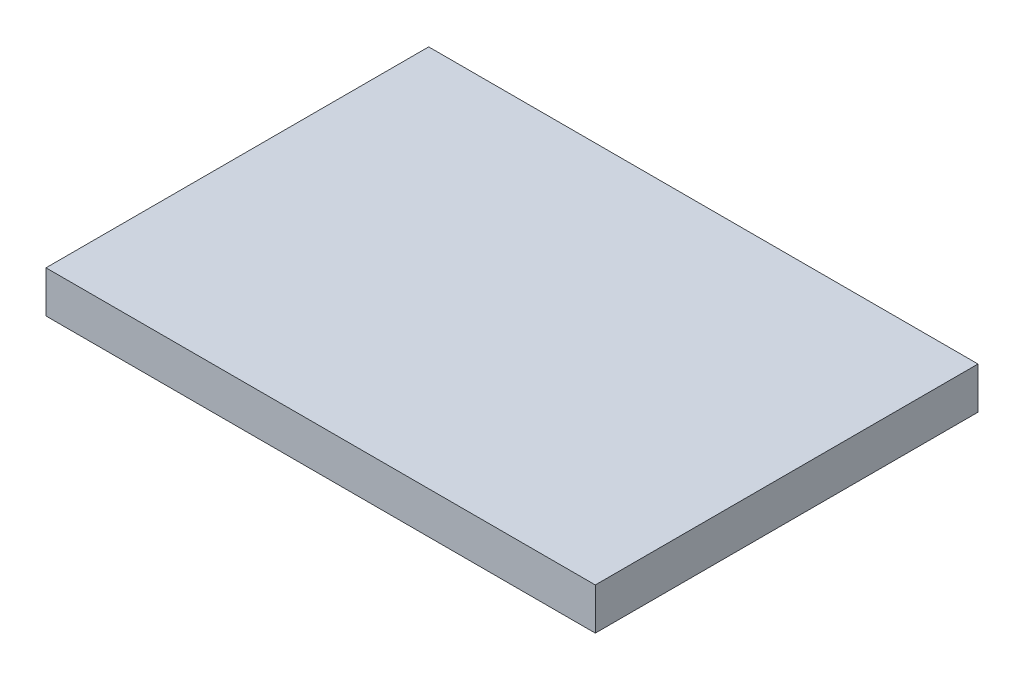
ISO-10303-21;
HEADER;
FILE_DESCRIPTION(('STEP AP214'),'2;1');
FILE_NAME('part.step','',(''),(''),'','','');
FILE_SCHEMA(('AUTOMOTIVE_DESIGN { 1 0 10303 214 1 1 1 1 }'));
ENDSEC;
DATA;
#1=APPLICATION_CONTEXT('core data for automotive mechanical design processes');
#2=APPLICATION_PROTOCOL_DEFINITION('international standard','automotive_design',2000,#1);
#3=PRODUCT_CONTEXT('',#1,'mechanical');
#4=PRODUCT('Part','Part','',(#3));
#5=PRODUCT_RELATED_PRODUCT_CATEGORY('part','',(#4));
#6=PRODUCT_DEFINITION_FORMATION('','',#4);
#7=PRODUCT_DEFINITION_CONTEXT('part definition',#1,'design');
#8=PRODUCT_DEFINITION('design','',#6,#7);
#9=PRODUCT_DEFINITION_SHAPE('','',#8);
#10=(LENGTH_UNIT() NAMED_UNIT(*) SI_UNIT(.MILLI.,.METRE.));
#11=(NAMED_UNIT(*) PLANE_ANGLE_UNIT() SI_UNIT($,.RADIAN.));
#12=(NAMED_UNIT(*) SI_UNIT($,.STERADIAN.) SOLID_ANGLE_UNIT());
#13=UNCERTAINTY_MEASURE_WITH_UNIT(LENGTH_MEASURE(1.E-05),#10,'distance_accuracy_value','');
#14=(GEOMETRIC_REPRESENTATION_CONTEXT(3) GLOBAL_UNCERTAINTY_ASSIGNED_CONTEXT((#13)) GLOBAL_UNIT_ASSIGNED_CONTEXT((#10,
#11,#12)) REPRESENTATION_CONTEXT('',''));
#15=CARTESIAN_POINT('',(0.,0.,0.));
#16=DIRECTION('',(0.,0.,1.));
#17=DIRECTION('',(1.,0.,0.));
#18=AXIS2_PLACEMENT_3D('',#15,#16,#17);
#19=CARTESIAN_POINT('',(-42.5,6.,-27.5));
#20=DIRECTION('',(1.,0.,0.));
#21=DIRECTION('',(0.,0.,-1.));
#22=AXIS2_PLACEMENT_3D('',#19,#20,#21);
#23=PLANE('',#22);
#24=DIRECTION('',(0.,0.,1.));
#25=VECTOR('',#24,1.);
#26=CARTESIAN_POINT('',(-42.5,0.,-27.5));
#27=LINE('',#26,#25);
#28=CARTESIAN_POINT('',(-42.5,0.,-27.5));
#29=VERTEX_POINT('',#28);
#30=CARTESIAN_POINT('',(-42.5,0.,27.5));
#31=VERTEX_POINT('',#30);
#32=EDGE_CURVE('E96',#29,#31,#27,.T.);
#33=ORIENTED_EDGE('',*,*,#32,.T.);
#34=DIRECTION('',(0.,-1.,0.));
#35=VECTOR('',#34,1.);
#36=CARTESIAN_POINT('',(-42.5,6.,27.5));
#37=LINE('',#36,#35);
#38=CARTESIAN_POINT('',(-42.5,6.,27.5));
#39=VERTEX_POINT('',#38);
#40=EDGE_CURVE('E11',#39,#31,#37,.T.);
#41=ORIENTED_EDGE('',*,*,#40,.F.);
#42=DIRECTION('',(0.,0.,1.));
#43=VECTOR('',#42,1.);
#44=CARTESIAN_POINT('',(-42.5,6.,-27.5));
#45=LINE('',#44,#43);
#46=CARTESIAN_POINT('',(-42.5,6.,-27.5));
#47=VERTEX_POINT('',#46);
#48=EDGE_CURVE('E84',#47,#39,#45,.T.);
#49=ORIENTED_EDGE('',*,*,#48,.F.);
#50=DIRECTION('',(0.,-1.,0.));
#51=VECTOR('',#50,1.);
#52=CARTESIAN_POINT('',(-42.5,6.,-27.5));
#53=LINE('',#52,#51);
#54=EDGE_CURVE('E92',#47,#29,#53,.T.);
#55=ORIENTED_EDGE('',*,*,#54,.T.);
#56=EDGE_LOOP('',(#33,#41,#49,#55));
#57=FACE_BOUND('',#56,.T.);
#58=ADVANCED_FACE('F33',(#57),#23,.F.);
#59=CARTESIAN_POINT('',(-42.5,6.,27.5));
#60=DIRECTION('',(0.,0.,-1.));
#61=DIRECTION('',(-1.,0.,0.));
#62=AXIS2_PLACEMENT_3D('',#59,#60,#61);
#63=PLANE('',#62);
#64=DIRECTION('',(1.,0.,0.));
#65=VECTOR('',#64,1.);
#66=CARTESIAN_POINT('',(-42.5,0.,27.5));
#67=LINE('',#66,#65);
#68=CARTESIAN_POINT('',(36.4465792802624,0.,27.5));
#69=VERTEX_POINT('',#68);
#70=EDGE_CURVE('E88',#31,#69,#67,.T.);
#71=ORIENTED_EDGE('',*,*,#70,.T.);
#72=DIRECTION('',(0.,-1.,0.));
#73=VECTOR('',#72,1.);
#74=CARTESIAN_POINT('',(36.4465792802624,6.,27.5));
#75=LINE('',#74,#73);
#76=CARTESIAN_POINT('',(36.4465792802624,6.,27.5));
#77=VERTEX_POINT('',#76);
#78=EDGE_CURVE('E41',#77,#69,#75,.T.);
#79=ORIENTED_EDGE('',*,*,#78,.F.);
#80=DIRECTION('',(1.,0.,0.));
#81=VECTOR('',#80,1.);
#82=CARTESIAN_POINT('',(-42.5,6.,27.5));
#83=LINE('',#82,#81);
#84=EDGE_CURVE('E79',#39,#77,#83,.T.);
#85=ORIENTED_EDGE('',*,*,#84,.F.);
#86=ORIENTED_EDGE('',*,*,#40,.T.);
#87=EDGE_LOOP('',(#71,#79,#85,#86));
#88=FACE_BOUND('',#87,.T.);
#89=ADVANCED_FACE('F87',(#88),#63,.F.);
#90=CARTESIAN_POINT('',(36.4465792802624,6.,-27.5));
#91=DIRECTION('',(-1.,0.,0.));
#92=DIRECTION('',(0.,0.,1.));
#93=AXIS2_PLACEMENT_3D('',#90,#91,#92);
#94=PLANE('',#93);
#95=DIRECTION('',(0.,0.,-1.));
#96=VECTOR('',#95,1.);
#97=CARTESIAN_POINT('',(36.4465792802624,0.,-27.5));
#98=LINE('',#97,#96);
#99=CARTESIAN_POINT('',(36.4465792802624,0.,-27.5));
#100=VERTEX_POINT('',#99);
#101=EDGE_CURVE('E66',#69,#100,#98,.T.);
#102=ORIENTED_EDGE('',*,*,#101,.T.);
#103=DIRECTION('',(0.,-1.,0.));
#104=VECTOR('',#103,1.);
#105=CARTESIAN_POINT('',(36.4465792802624,6.,-27.5));
#106=LINE('',#105,#104);
#107=CARTESIAN_POINT('',(36.4465792802624,6.,-27.5));
#108=VERTEX_POINT('',#107);
#109=EDGE_CURVE('E89',#108,#100,#106,.T.);
#110=ORIENTED_EDGE('',*,*,#109,.F.);
#111=DIRECTION('',(0.,0.,-1.));
#112=VECTOR('',#111,1.);
#113=CARTESIAN_POINT('',(36.4465792802624,6.,-27.5));
#114=LINE('',#113,#112);
#115=EDGE_CURVE('E82',#77,#108,#114,.T.);
#116=ORIENTED_EDGE('',*,*,#115,.F.);
#117=ORIENTED_EDGE('',*,*,#78,.T.);
#118=EDGE_LOOP('',(#102,#110,#116,#117));
#119=FACE_BOUND('',#118,.T.);
#120=ADVANCED_FACE('F90',(#119),#94,.F.);
#121=CARTESIAN_POINT('',(-42.5,6.,-27.5));
#122=DIRECTION('',(0.,0.,1.));
#123=DIRECTION('',(1.,0.,0.));
#124=AXIS2_PLACEMENT_3D('',#121,#122,#123);
#125=PLANE('',#124);
#126=DIRECTION('',(-1.,0.,0.));
#127=VECTOR('',#126,1.);
#128=CARTESIAN_POINT('',(-42.5,0.,-27.5));
#129=LINE('',#128,#127);
#130=EDGE_CURVE('E72',#100,#29,#129,.T.);
#131=ORIENTED_EDGE('',*,*,#130,.T.);
#132=ORIENTED_EDGE('',*,*,#54,.F.);
#133=DIRECTION('',(-1.,0.,0.));
#134=VECTOR('',#133,1.);
#135=CARTESIAN_POINT('',(-42.5,6.,-27.5));
#136=LINE('',#135,#134);
#137=EDGE_CURVE('E49',#108,#47,#136,.T.);
#138=ORIENTED_EDGE('',*,*,#137,.F.);
#139=ORIENTED_EDGE('',*,*,#109,.T.);
#140=EDGE_LOOP('',(#131,#132,#138,#139));
#141=FACE_BOUND('',#140,.T.);
#142=ADVANCED_FACE('F103',(#141),#125,.F.);
#143=CARTESIAN_POINT('',(-42.5,6.,27.5));
#144=DIRECTION('',(0.,1.,0.));
#145=DIRECTION('',(0.,0.,1.));
#146=AXIS2_PLACEMENT_3D('',#143,#144,#145);
#147=PLANE('',#146);
#148=ORIENTED_EDGE('',*,*,#48,.T.);
#149=ORIENTED_EDGE('',*,*,#84,.T.);
#150=ORIENTED_EDGE('',*,*,#115,.T.);
#151=ORIENTED_EDGE('',*,*,#137,.T.);
#152=EDGE_LOOP('',(#148,#149,#150,#151));
#153=FACE_BOUND('',#152,.T.);
#154=ADVANCED_FACE('F80',(#153),#147,.T.);
#155=CARTESIAN_POINT('',(-42.5,0.,27.5));
#156=DIRECTION('',(0.,1.,0.));
#157=DIRECTION('',(0.,0.,1.));
#158=AXIS2_PLACEMENT_3D('',#155,#156,#157);
#159=PLANE('',#158);
#160=ORIENTED_EDGE('',*,*,#32,.F.);
#161=ORIENTED_EDGE('',*,*,#130,.F.);
#162=ORIENTED_EDGE('',*,*,#101,.F.);
#163=ORIENTED_EDGE('',*,*,#70,.F.);
#164=EDGE_LOOP('',(#160,#161,#162,#163));
#165=FACE_BOUND('',#164,.T.);
#166=ADVANCED_FACE('F106',(#165),#159,.F.);
#167=CLOSED_SHELL('',(#58,#89,#120,#142,#154,#166));
#168=MANIFOLD_SOLID_BREP('B2',#167);
#169=ADVANCED_BREP_SHAPE_REPRESENTATION('',(#18,#168),#14);
#170=SHAPE_DEFINITION_REPRESENTATION(#9,#169);
ENDSEC;
END-ISO-10303-21;
